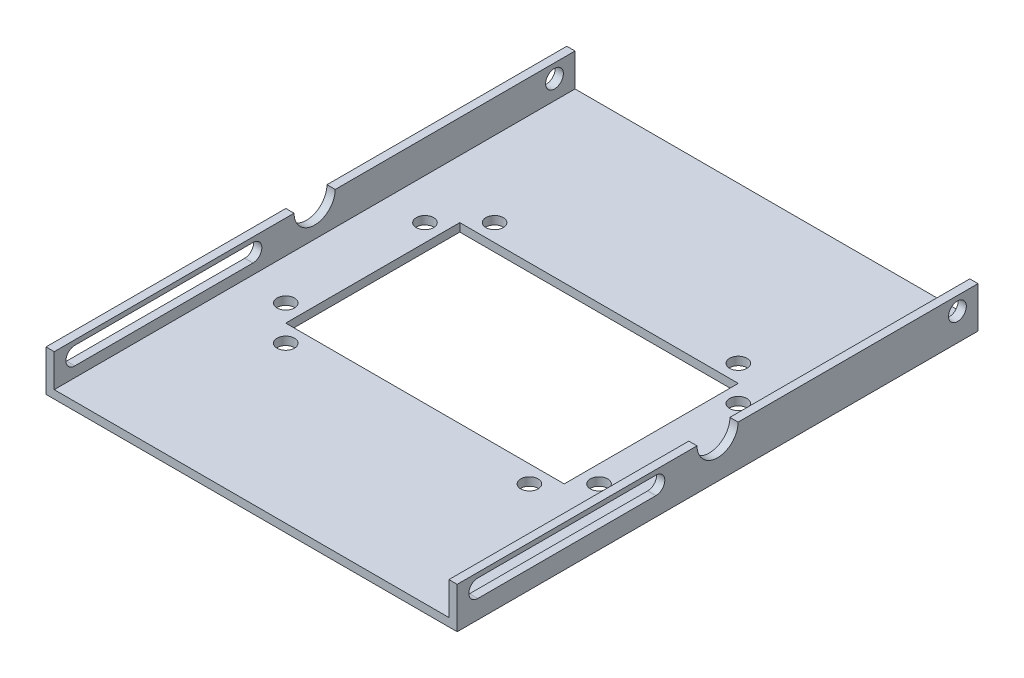
ISO-10303-21;
HEADER;
FILE_DESCRIPTION(('STEP AP214'),'2;1');
FILE_NAME('part.step','',(''),(''),'','','');
FILE_SCHEMA(('AUTOMOTIVE_DESIGN { 1 0 10303 214 1 1 1 1 }'));
ENDSEC;
DATA;
#1=APPLICATION_CONTEXT('core data for automotive mechanical design processes');
#2=APPLICATION_PROTOCOL_DEFINITION('international standard','automotive_design',2000,#1);
#3=PRODUCT_CONTEXT('',#1,'mechanical');
#4=PRODUCT('Part','Part','',(#3));
#5=PRODUCT_RELATED_PRODUCT_CATEGORY('part','',(#4));
#6=PRODUCT_DEFINITION_FORMATION('','',#4);
#7=PRODUCT_DEFINITION_CONTEXT('part definition',#1,'design');
#8=PRODUCT_DEFINITION('design','',#6,#7);
#9=PRODUCT_DEFINITION_SHAPE('','',#8);
#10=(LENGTH_UNIT() NAMED_UNIT(*) SI_UNIT(.MILLI.,.METRE.));
#11=(NAMED_UNIT(*) PLANE_ANGLE_UNIT() SI_UNIT($,.RADIAN.));
#12=(NAMED_UNIT(*) SI_UNIT($,.STERADIAN.) SOLID_ANGLE_UNIT());
#13=UNCERTAINTY_MEASURE_WITH_UNIT(LENGTH_MEASURE(1.E-05),#10,'distance_accuracy_value','');
#14=(GEOMETRIC_REPRESENTATION_CONTEXT(3) GLOBAL_UNCERTAINTY_ASSIGNED_CONTEXT((#13)) GLOBAL_UNIT_ASSIGNED_CONTEXT((#10,
#11,#12)) REPRESENTATION_CONTEXT('',''));
#15=CARTESIAN_POINT('',(0.,0.,0.));
#16=DIRECTION('',(0.,0.,1.));
#17=DIRECTION('',(1.,0.,0.));
#18=AXIS2_PLACEMENT_3D('',#15,#16,#17);
#19=CARTESIAN_POINT('',(-75.,15.,-95.));
#20=DIRECTION('',(0.,-1.,0.));
#21=DIRECTION('',(0.,0.,-1.));
#22=AXIS2_PLACEMENT_3D('',#19,#20,#21);
#23=PLANE('',#22);
#24=DIRECTION('',(0.,0.,1.));
#25=VECTOR('',#24,1.);
#26=CARTESIAN_POINT('',(-75.,15.,-95.));
#27=LINE('',#26,#25);
#28=CARTESIAN_POINT('',(-75.,15.,-95.));
#29=VERTEX_POINT('',#28);
#30=CARTESIAN_POINT('',(-75.,15.,-7.5));
#31=VERTEX_POINT('',#30);
#32=EDGE_CURVE('E390',#29,#31,#27,.T.);
#33=ORIENTED_EDGE('',*,*,#32,.T.);
#34=DIRECTION('',(1.,0.,0.));
#35=VECTOR('',#34,1.);
#36=CARTESIAN_POINT('',(-75.,15.,-7.5));
#37=LINE('',#36,#35);
#38=CARTESIAN_POINT('',(-72.,15.,-7.5));
#39=VERTEX_POINT('',#38);
#40=EDGE_CURVE('E278',#31,#39,#37,.T.);
#41=ORIENTED_EDGE('',*,*,#40,.T.);
#42=DIRECTION('',(0.,0.,1.));
#43=VECTOR('',#42,1.);
#44=CARTESIAN_POINT('',(-72.,15.,-95.));
#45=LINE('',#44,#43);
#46=CARTESIAN_POINT('',(-72.,15.,-95.));
#47=VERTEX_POINT('',#46);
#48=EDGE_CURVE('E394',#47,#39,#45,.T.);
#49=ORIENTED_EDGE('',*,*,#48,.F.);
#50=DIRECTION('',(1.,0.,0.));
#51=VECTOR('',#50,1.);
#52=CARTESIAN_POINT('',(-75.,15.,-95.));
#53=LINE('',#52,#51);
#54=EDGE_CURVE('E376',#29,#47,#53,.T.);
#55=ORIENTED_EDGE('',*,*,#54,.F.);
#56=EDGE_LOOP('',(#33,#41,#49,#55));
#57=FACE_BOUND('',#56,.T.);
#58=ADVANCED_FACE('F44',(#57),#23,.F.);
#59=CARTESIAN_POINT('',(72.,15.,-95.));
#60=DIRECTION('',(0.,-1.,0.));
#61=DIRECTION('',(0.,0.,-1.));
#62=AXIS2_PLACEMENT_3D('',#59,#60,#61);
#63=PLANE('',#62);
#64=DIRECTION('',(0.,0.,1.));
#65=VECTOR('',#64,1.);
#66=CARTESIAN_POINT('',(72.,15.,-95.));
#67=LINE('',#66,#65);
#68=CARTESIAN_POINT('',(72.,15.,-95.));
#69=VERTEX_POINT('',#68);
#70=CARTESIAN_POINT('',(72.,15.,-7.5));
#71=VERTEX_POINT('',#70);
#72=EDGE_CURVE('E402',#69,#71,#67,.T.);
#73=ORIENTED_EDGE('',*,*,#72,.T.);
#74=DIRECTION('',(1.,0.,0.));
#75=VECTOR('',#74,1.);
#76=CARTESIAN_POINT('',(-75.,15.,-7.5));
#77=LINE('',#76,#75);
#78=CARTESIAN_POINT('',(75.,15.,-7.5));
#79=VERTEX_POINT('',#78);
#80=EDGE_CURVE('E13',#71,#79,#77,.T.);
#81=ORIENTED_EDGE('',*,*,#80,.T.);
#82=DIRECTION('',(0.,0.,1.));
#83=VECTOR('',#82,1.);
#84=CARTESIAN_POINT('',(75.,15.,-95.));
#85=LINE('',#84,#83);
#86=CARTESIAN_POINT('',(75.,15.,-95.));
#87=VERTEX_POINT('',#86);
#88=EDGE_CURVE('E406',#87,#79,#85,.T.);
#89=ORIENTED_EDGE('',*,*,#88,.F.);
#90=DIRECTION('',(1.,0.,0.));
#91=VECTOR('',#90,1.);
#92=CARTESIAN_POINT('',(72.,15.,-95.));
#93=LINE('',#92,#91);
#94=EDGE_CURVE('E368',#69,#87,#93,.T.);
#95=ORIENTED_EDGE('',*,*,#94,.F.);
#96=EDGE_LOOP('',(#73,#81,#89,#95));
#97=FACE_BOUND('',#96,.T.);
#98=ADVANCED_FACE('F467',(#97),#63,.F.);
#99=CARTESIAN_POINT('',(75.,0.,-95.));
#100=DIRECTION('',(1.,0.,0.));
#101=DIRECTION('',(0.,0.,-1.));
#102=AXIS2_PLACEMENT_3D('',#99,#100,#101);
#103=PLANE('',#102);
#104=CARTESIAN_POINT('',(75.,15.,0.));
#105=DIRECTION('',(1.,0.,0.));
#106=DIRECTION('',(0.,0.,-1.));
#107=AXIS2_PLACEMENT_3D('',#104,#105,#106);
#108=CIRCLE('',#107,7.5);
#109=CARTESIAN_POINT('',(75.,15.,7.5));
#110=VERTEX_POINT('',#109);
#111=EDGE_CURVE('E270',#110,#79,#108,.T.);
#112=ORIENTED_EDGE('',*,*,#111,.F.);
#113=CARTESIAN_POINT('',(75.,15.,95.));
#114=VERTEX_POINT('',#113);
#115=EDGE_CURVE('E384',#110,#114,#85,.T.);
#116=ORIENTED_EDGE('',*,*,#115,.T.);
#117=DIRECTION('',(0.,1.,0.));
#118=VECTOR('',#117,1.);
#119=CARTESIAN_POINT('',(75.,0.,95.));
#120=LINE('',#119,#118);
#121=CARTESIAN_POINT('',(75.,0.,95.));
#122=VERTEX_POINT('',#121);
#123=EDGE_CURVE('E341',#122,#114,#120,.T.);
#124=ORIENTED_EDGE('',*,*,#123,.F.);
#125=DIRECTION('',(0.,0.,1.));
#126=VECTOR('',#125,1.);
#127=CARTESIAN_POINT('',(75.,0.,-95.));
#128=LINE('',#127,#126);
#129=CARTESIAN_POINT('',(75.,0.,-95.));
#130=VERTEX_POINT('',#129);
#131=EDGE_CURVE('E385',#130,#122,#128,.T.);
#132=ORIENTED_EDGE('',*,*,#131,.F.);
#133=DIRECTION('',(0.,1.,0.));
#134=VECTOR('',#133,1.);
#135=CARTESIAN_POINT('',(75.,0.,-95.));
#136=LINE('',#135,#134);
#137=EDGE_CURVE('E365',#130,#87,#136,.T.);
#138=ORIENTED_EDGE('',*,*,#137,.T.);
#139=ORIENTED_EDGE('',*,*,#88,.T.);
#140=EDGE_LOOP('',(#112,#116,#124,#132,#138,#139));
#141=FACE_BOUND('',#140,.T.);
#142=CARTESIAN_POINT('',(75.,10.,-87.5));
#143=DIRECTION('',(-1.,0.,0.));
#144=DIRECTION('',(0.,0.,1.));
#145=AXIS2_PLACEMENT_3D('',#142,#143,#144);
#146=CIRCLE('',#145,3.23850000000001);
#147=CARTESIAN_POINT('',(75.,10.,-84.2615));
#148=VERTEX_POINT('',#147);
#149=EDGE_CURVE('E282',#148,#148,#146,.T.);
#150=ORIENTED_EDGE('',*,*,#149,.T.);
#151=EDGE_LOOP('',(#150));
#152=FACE_BOUND('',#151,.T.);
#153=CARTESIAN_POINT('',(75.,10.,87.5));
#154=DIRECTION('',(-1.,0.,0.));
#155=DIRECTION('',(0.,0.,1.));
#156=AXIS2_PLACEMENT_3D('',#153,#154,#155);
#157=CIRCLE('',#156,3.2385);
#158=CARTESIAN_POINT('',(75.,6.76150000000002,87.5));
#159=VERTEX_POINT('',#158);
#160=CARTESIAN_POINT('',(75.,13.2385,87.5));
#161=VERTEX_POINT('',#160);
#162=EDGE_CURVE('E290',#159,#161,#157,.T.);
#163=ORIENTED_EDGE('',*,*,#162,.T.);
#164=DIRECTION('',(0.,0.,-1.));
#165=VECTOR('',#164,1.);
#166=CARTESIAN_POINT('',(75.,13.2385,87.5));
#167=LINE('',#166,#165);
#168=CARTESIAN_POINT('',(75.,13.2385,22.5));
#169=VERTEX_POINT('',#168);
#170=EDGE_CURVE('E293',#161,#169,#167,.T.);
#171=ORIENTED_EDGE('',*,*,#170,.T.);
#172=CARTESIAN_POINT('',(75.,10.,22.5));
#173=DIRECTION('',(-1.,0.,0.));
#174=DIRECTION('',(0.,0.,1.));
#175=AXIS2_PLACEMENT_3D('',#172,#173,#174);
#176=CIRCLE('',#175,3.2385);
#177=CARTESIAN_POINT('',(75.,6.76150000000001,22.5));
#178=VERTEX_POINT('',#177);
#179=EDGE_CURVE('E297',#169,#178,#176,.T.);
#180=ORIENTED_EDGE('',*,*,#179,.T.);
#181=DIRECTION('',(0.,0.,1.));
#182=VECTOR('',#181,1.);
#183=CARTESIAN_POINT('',(75.,6.76150000000002,87.5));
#184=LINE('',#183,#182);
#185=EDGE_CURVE('E300',#178,#159,#184,.T.);
#186=ORIENTED_EDGE('',*,*,#185,.T.);
#187=EDGE_LOOP('',(#163,#171,#180,#186));
#188=FACE_BOUND('',#187,.T.);
#189=ADVANCED_FACE('F46',(#141,#152,#188),#103,.T.);
#190=CARTESIAN_POINT('',(-75.,0.,-95.));
#191=DIRECTION('',(0.,-1.,0.));
#192=DIRECTION('',(0.,0.,-1.));
#193=AXIS2_PLACEMENT_3D('',#190,#191,#192);
#194=PLANE('',#193);
#195=CARTESIAN_POINT('',(-44.45,0.,-38.1));
#196=DIRECTION('',(0.,-1.,0.));
#197=DIRECTION('',(0.,0.,-1.));
#198=AXIS2_PLACEMENT_3D('',#195,#196,#197);
#199=CIRCLE('',#198,3.175);
#200=CARTESIAN_POINT('',(-44.45,0.,-41.275));
#201=VERTEX_POINT('',#200);
#202=EDGE_CURVE('E261',#201,#201,#199,.T.);
#203=ORIENTED_EDGE('',*,*,#202,.F.);
#204=EDGE_LOOP('',(#203));
#205=FACE_BOUND('',#204,.T.);
#206=CARTESIAN_POINT('',(44.45,0.,-38.1));
#207=DIRECTION('',(0.,-1.,0.));
#208=DIRECTION('',(0.,0.,-1.));
#209=AXIS2_PLACEMENT_3D('',#206,#207,#208);
#210=CIRCLE('',#209,3.175);
#211=CARTESIAN_POINT('',(44.45,0.,-41.275));
#212=VERTEX_POINT('',#211);
#213=EDGE_CURVE('E258',#212,#212,#210,.T.);
#214=ORIENTED_EDGE('',*,*,#213,.F.);
#215=EDGE_LOOP('',(#214));
#216=FACE_BOUND('',#215,.T.);
#217=CARTESIAN_POINT('',(-44.45,0.,38.1));
#218=DIRECTION('',(0.,-1.,0.));
#219=DIRECTION('',(0.,0.,-1.));
#220=AXIS2_PLACEMENT_3D('',#217,#218,#219);
#221=CIRCLE('',#220,3.175);
#222=CARTESIAN_POINT('',(-44.45,0.,34.925));
#223=VERTEX_POINT('',#222);
#224=EDGE_CURVE('E255',#223,#223,#221,.T.);
#225=ORIENTED_EDGE('',*,*,#224,.F.);
#226=EDGE_LOOP('',(#225));
#227=FACE_BOUND('',#226,.T.);
#228=CARTESIAN_POINT('',(44.45,0.,38.1));
#229=DIRECTION('',(0.,-1.,0.));
#230=DIRECTION('',(0.,0.,-1.));
#231=AXIS2_PLACEMENT_3D('',#228,#229,#230);
#232=CIRCLE('',#231,3.175);
#233=CARTESIAN_POINT('',(44.45,0.,34.925));
#234=VERTEX_POINT('',#233);
#235=EDGE_CURVE('E252',#234,#234,#232,.T.);
#236=ORIENTED_EDGE('',*,*,#235,.F.);
#237=EDGE_LOOP('',(#236));
#238=FACE_BOUND('',#237,.T.);
#239=CARTESIAN_POINT('',(-57.15,0.,-25.4));
#240=DIRECTION('',(0.,-1.,0.));
#241=DIRECTION('',(0.,0.,-1.));
#242=AXIS2_PLACEMENT_3D('',#239,#240,#241);
#243=CIRCLE('',#242,3.17499999999997);
#244=CARTESIAN_POINT('',(-57.15,0.,-28.575));
#245=VERTEX_POINT('',#244);
#246=EDGE_CURVE('E249',#245,#245,#243,.T.);
#247=ORIENTED_EDGE('',*,*,#246,.F.);
#248=EDGE_LOOP('',(#247));
#249=FACE_BOUND('',#248,.T.);
#250=CARTESIAN_POINT('',(57.15,0.,-25.4));
#251=DIRECTION('',(0.,-1.,0.));
#252=DIRECTION('',(0.,0.,-1.));
#253=AXIS2_PLACEMENT_3D('',#250,#251,#252);
#254=CIRCLE('',#253,3.175);
#255=CARTESIAN_POINT('',(57.15,0.,-28.575));
#256=VERTEX_POINT('',#255);
#257=EDGE_CURVE('E246',#256,#256,#254,.T.);
#258=ORIENTED_EDGE('',*,*,#257,.F.);
#259=EDGE_LOOP('',(#258));
#260=FACE_BOUND('',#259,.T.);
#261=CARTESIAN_POINT('',(-57.15,0.,25.4));
#262=DIRECTION('',(0.,-1.,0.));
#263=DIRECTION('',(0.,0.,-1.));
#264=AXIS2_PLACEMENT_3D('',#261,#262,#263);
#265=CIRCLE('',#264,3.17499999999997);
#266=CARTESIAN_POINT('',(-57.15,0.,22.225));
#267=VERTEX_POINT('',#266);
#268=EDGE_CURVE('E243',#267,#267,#265,.T.);
#269=ORIENTED_EDGE('',*,*,#268,.F.);
#270=EDGE_LOOP('',(#269));
#271=FACE_BOUND('',#270,.T.);
#272=CARTESIAN_POINT('',(57.15,0.,25.4));
#273=DIRECTION('',(0.,-1.,0.));
#274=DIRECTION('',(0.,0.,-1.));
#275=AXIS2_PLACEMENT_3D('',#272,#273,#274);
#276=CIRCLE('',#275,3.175);
#277=CARTESIAN_POINT('',(57.15,0.,22.225));
#278=VERTEX_POINT('',#277);
#279=EDGE_CURVE('E240',#278,#278,#276,.T.);
#280=ORIENTED_EDGE('',*,*,#279,.F.);
#281=EDGE_LOOP('',(#280));
#282=FACE_BOUND('',#281,.T.);
#283=DIRECTION('',(0.,0.,1.));
#284=VECTOR('',#283,1.);
#285=CARTESIAN_POINT('',(50.8,0.,-95.));
#286=LINE('',#285,#284);
#287=CARTESIAN_POINT('',(50.8,0.,-31.75));
#288=VERTEX_POINT('',#287);
#289=CARTESIAN_POINT('',(50.8,0.,31.75));
#290=VERTEX_POINT('',#289);
#291=EDGE_CURVE('E238',#288,#290,#286,.T.);
#292=ORIENTED_EDGE('',*,*,#291,.F.);
#293=DIRECTION('',(1.,0.,0.));
#294=VECTOR('',#293,1.);
#295=CARTESIAN_POINT('',(-75.,0.,-31.75));
#296=LINE('',#295,#294);
#297=CARTESIAN_POINT('',(-50.8,0.,-31.75));
#298=VERTEX_POINT('',#297);
#299=EDGE_CURVE('E231',#298,#288,#296,.T.);
#300=ORIENTED_EDGE('',*,*,#299,.F.);
#301=DIRECTION('',(0.,0.,-1.));
#302=VECTOR('',#301,1.);
#303=CARTESIAN_POINT('',(-50.8,0.,-95.));
#304=LINE('',#303,#302);
#305=CARTESIAN_POINT('',(-50.8,0.,31.75));
#306=VERTEX_POINT('',#305);
#307=EDGE_CURVE('E211',#306,#298,#304,.T.);
#308=ORIENTED_EDGE('',*,*,#307,.F.);
#309=DIRECTION('',(-1.,0.,0.));
#310=VECTOR('',#309,1.);
#311=CARTESIAN_POINT('',(-75.,0.,31.75));
#312=LINE('',#311,#310);
#313=EDGE_CURVE('E236',#290,#306,#312,.T.);
#314=ORIENTED_EDGE('',*,*,#313,.F.);
#315=EDGE_LOOP('',(#292,#300,#308,#314));
#316=FACE_BOUND('',#315,.T.);
#317=ORIENTED_EDGE('',*,*,#131,.T.);
#318=DIRECTION('',(1.,0.,0.));
#319=VECTOR('',#318,1.);
#320=CARTESIAN_POINT('',(-75.,0.,95.));
#321=LINE('',#320,#319);
#322=CARTESIAN_POINT('',(-75.,0.,95.));
#323=VERTEX_POINT('',#322);
#324=EDGE_CURVE('E362',#323,#122,#321,.T.);
#325=ORIENTED_EDGE('',*,*,#324,.F.);
#326=DIRECTION('',(0.,0.,1.));
#327=VECTOR('',#326,1.);
#328=CARTESIAN_POINT('',(-75.,0.,-95.));
#329=LINE('',#328,#327);
#330=CARTESIAN_POINT('',(-75.,0.,-95.));
#331=VERTEX_POINT('',#330);
#332=EDGE_CURVE('E388',#331,#323,#329,.T.);
#333=ORIENTED_EDGE('',*,*,#332,.F.);
#334=DIRECTION('',(1.,0.,0.));
#335=VECTOR('',#334,1.);
#336=CARTESIAN_POINT('',(-75.,0.,-95.));
#337=LINE('',#336,#335);
#338=EDGE_CURVE('E381',#331,#130,#337,.T.);
#339=ORIENTED_EDGE('',*,*,#338,.T.);
#340=EDGE_LOOP('',(#317,#325,#333,#339));
#341=FACE_BOUND('',#340,.T.);
#342=ADVANCED_FACE('F456',(#205,#216,#227,#238,#249,#260,#271,#282,#316,#341),#194,.T.);
#343=CARTESIAN_POINT('',(-75.,0.,-95.));
#344=DIRECTION('',(-1.,0.,0.));
#345=DIRECTION('',(0.,0.,1.));
#346=AXIS2_PLACEMENT_3D('',#343,#344,#345);
#347=PLANE('',#346);
#348=CARTESIAN_POINT('',(-75.,15.,0.));
#349=DIRECTION('',(1.,0.,0.));
#350=DIRECTION('',(0.,0.,-1.));
#351=AXIS2_PLACEMENT_3D('',#348,#349,#350);
#352=CIRCLE('',#351,7.5);
#353=CARTESIAN_POINT('',(-75.,15.,7.5));
#354=VERTEX_POINT('',#353);
#355=EDGE_CURVE('E264',#354,#31,#352,.T.);
#356=ORIENTED_EDGE('',*,*,#355,.T.);
#357=ORIENTED_EDGE('',*,*,#32,.F.);
#358=DIRECTION('',(0.,-1.,0.));
#359=VECTOR('',#358,1.);
#360=CARTESIAN_POINT('',(-75.,0.,-95.));
#361=LINE('',#360,#359);
#362=EDGE_CURVE('E378',#29,#331,#361,.T.);
#363=ORIENTED_EDGE('',*,*,#362,.T.);
#364=ORIENTED_EDGE('',*,*,#332,.T.);
#365=DIRECTION('',(0.,-1.,0.));
#366=VECTOR('',#365,1.);
#367=CARTESIAN_POINT('',(-75.,0.,95.));
#368=LINE('',#367,#366);
#369=CARTESIAN_POINT('',(-75.,15.,95.));
#370=VERTEX_POINT('',#369);
#371=EDGE_CURVE('E359',#370,#323,#368,.T.);
#372=ORIENTED_EDGE('',*,*,#371,.F.);
#373=EDGE_CURVE('E393',#354,#370,#27,.T.);
#374=ORIENTED_EDGE('',*,*,#373,.F.);
#375=EDGE_LOOP('',(#356,#357,#363,#364,#372,#374));
#376=FACE_BOUND('',#375,.T.);
#377=CARTESIAN_POINT('',(-75.,10.,-87.5));
#378=DIRECTION('',(-1.,0.,0.));
#379=DIRECTION('',(0.,0.,1.));
#380=AXIS2_PLACEMENT_3D('',#377,#378,#379);
#381=CIRCLE('',#380,3.23850000000001);
#382=CARTESIAN_POINT('',(-75.,10.,-84.2615));
#383=VERTEX_POINT('',#382);
#384=EDGE_CURVE('E286',#383,#383,#381,.T.);
#385=ORIENTED_EDGE('',*,*,#384,.F.);
#386=EDGE_LOOP('',(#385));
#387=FACE_BOUND('',#386,.T.);
#388=CARTESIAN_POINT('',(-75.,10.,87.5));
#389=DIRECTION('',(-1.,0.,0.));
#390=DIRECTION('',(0.,0.,1.));
#391=AXIS2_PLACEMENT_3D('',#388,#389,#390);
#392=CIRCLE('',#391,3.2385);
#393=CARTESIAN_POINT('',(-75.,6.76150000000002,87.5));
#394=VERTEX_POINT('',#393);
#395=CARTESIAN_POINT('',(-75.,13.2385,87.5));
#396=VERTEX_POINT('',#395);
#397=EDGE_CURVE('E281',#394,#396,#392,.T.);
#398=ORIENTED_EDGE('',*,*,#397,.F.);
#399=DIRECTION('',(0.,0.,1.));
#400=VECTOR('',#399,1.);
#401=CARTESIAN_POINT('',(-75.,6.76150000000002,87.5));
#402=LINE('',#401,#400);
#403=CARTESIAN_POINT('',(-75.,6.76150000000001,22.5));
#404=VERTEX_POINT('',#403);
#405=EDGE_CURVE('E294',#404,#394,#402,.T.);
#406=ORIENTED_EDGE('',*,*,#405,.F.);
#407=CARTESIAN_POINT('',(-75.,10.,22.5));
#408=DIRECTION('',(-1.,0.,0.));
#409=DIRECTION('',(0.,0.,1.));
#410=AXIS2_PLACEMENT_3D('',#407,#408,#409);
#411=CIRCLE('',#410,3.2385);
#412=CARTESIAN_POINT('',(-75.,13.2385,22.5));
#413=VERTEX_POINT('',#412);
#414=EDGE_CURVE('E308',#413,#404,#411,.T.);
#415=ORIENTED_EDGE('',*,*,#414,.F.);
#416=DIRECTION('',(0.,0.,-1.));
#417=VECTOR('',#416,1.);
#418=CARTESIAN_POINT('',(-75.,13.2385,87.5));
#419=LINE('',#418,#417);
#420=EDGE_CURVE('E305',#396,#413,#419,.T.);
#421=ORIENTED_EDGE('',*,*,#420,.F.);
#422=EDGE_LOOP('',(#398,#406,#415,#421));
#423=FACE_BOUND('',#422,.T.);
#424=ADVANCED_FACE('F451',(#376,#387,#423),#347,.T.);
#425=CARTESIAN_POINT('',(-72.,15.,7.5));
#426=VERTEX_POINT('',#425);
#427=CARTESIAN_POINT('',(-72.,15.,95.));
#428=VERTEX_POINT('',#427);
#429=EDGE_CURVE('E397',#426,#428,#45,.T.);
#430=ORIENTED_EDGE('',*,*,#429,.F.);
#431=DIRECTION('',(1.,0.,0.));
#432=VECTOR('',#431,1.);
#433=CARTESIAN_POINT('',(-75.,15.,7.5));
#434=LINE('',#433,#432);
#435=EDGE_CURVE('E275',#426,#354,#434,.F.);
#436=ORIENTED_EDGE('',*,*,#435,.T.);
#437=ORIENTED_EDGE('',*,*,#373,.T.);
#438=DIRECTION('',(1.,0.,0.));
#439=VECTOR('',#438,1.);
#440=CARTESIAN_POINT('',(-75.,15.,95.));
#441=LINE('',#440,#439);
#442=EDGE_CURVE('E356',#370,#428,#441,.T.);
#443=ORIENTED_EDGE('',*,*,#442,.T.);
#444=EDGE_LOOP('',(#430,#436,#437,#443));
#445=FACE_BOUND('',#444,.T.);
#446=ADVANCED_FACE('F447',(#445),#23,.F.);
#447=CARTESIAN_POINT('',(-72.,0.,-95.));
#448=DIRECTION('',(-1.,0.,0.));
#449=DIRECTION('',(0.,0.,1.));
#450=AXIS2_PLACEMENT_3D('',#447,#448,#449);
#451=PLANE('',#450);
#452=CARTESIAN_POINT('',(-72.,10.,-87.5));
#453=DIRECTION('',(-1.,0.,0.));
#454=DIRECTION('',(0.,0.,1.));
#455=AXIS2_PLACEMENT_3D('',#452,#453,#454);
#456=CIRCLE('',#455,3.23850000000001);
#457=CARTESIAN_POINT('',(-72.,10.,-84.2615));
#458=VERTEX_POINT('',#457);
#459=EDGE_CURVE('E338',#458,#458,#456,.T.);
#460=ORIENTED_EDGE('',*,*,#459,.T.);
#461=EDGE_LOOP('',(#460));
#462=FACE_BOUND('',#461,.T.);
#463=DIRECTION('',(0.,0.,1.));
#464=VECTOR('',#463,1.);
#465=CARTESIAN_POINT('',(-72.,6.7615,-95.));
#466=LINE('',#465,#464);
#467=CARTESIAN_POINT('',(-72.,6.76150000000001,22.5));
#468=VERTEX_POINT('',#467);
#469=CARTESIAN_POINT('',(-72.,6.76150000000002,87.5));
#470=VERTEX_POINT('',#469);
#471=EDGE_CURVE('E331',#468,#470,#466,.T.);
#472=ORIENTED_EDGE('',*,*,#471,.T.);
#473=CARTESIAN_POINT('',(-72.,10.,87.5));
#474=DIRECTION('',(-1.,0.,0.));
#475=DIRECTION('',(0.,0.,1.));
#476=AXIS2_PLACEMENT_3D('',#473,#474,#475);
#477=CIRCLE('',#476,3.2385);
#478=CARTESIAN_POINT('',(-72.,13.2385,87.5));
#479=VERTEX_POINT('',#478);
#480=EDGE_CURVE('E334',#470,#479,#477,.T.);
#481=ORIENTED_EDGE('',*,*,#480,.T.);
#482=DIRECTION('',(0.,0.,-1.));
#483=VECTOR('',#482,1.);
#484=CARTESIAN_POINT('',(-72.,13.2385,-95.));
#485=LINE('',#484,#483);
#486=CARTESIAN_POINT('',(-72.,13.2385,22.5));
#487=VERTEX_POINT('',#486);
#488=EDGE_CURVE('E285',#479,#487,#485,.T.);
#489=ORIENTED_EDGE('',*,*,#488,.T.);
#490=CARTESIAN_POINT('',(-72.,10.,22.5));
#491=DIRECTION('',(-1.,0.,0.));
#492=DIRECTION('',(0.,0.,1.));
#493=AXIS2_PLACEMENT_3D('',#490,#491,#492);
#494=CIRCLE('',#493,3.2385);
#495=EDGE_CURVE('E328',#487,#468,#494,.T.);
#496=ORIENTED_EDGE('',*,*,#495,.T.);
#497=EDGE_LOOP('',(#472,#481,#489,#496));
#498=FACE_BOUND('',#497,.T.);
#499=ORIENTED_EDGE('',*,*,#48,.T.);
#500=CARTESIAN_POINT('',(-72.,15.,0.));
#501=DIRECTION('',(-1.,0.,0.));
#502=DIRECTION('',(0.,0.,1.));
#503=AXIS2_PLACEMENT_3D('',#500,#501,#502);
#504=CIRCLE('',#503,7.5);
#505=EDGE_CURVE('E272',#39,#426,#504,.T.);
#506=ORIENTED_EDGE('',*,*,#505,.T.);
#507=ORIENTED_EDGE('',*,*,#429,.T.);
#508=DIRECTION('',(0.,1.,0.));
#509=VECTOR('',#508,1.);
#510=CARTESIAN_POINT('',(-72.,0.,95.));
#511=LINE('',#510,#509);
#512=CARTESIAN_POINT('',(-72.,3.,95.));
#513=VERTEX_POINT('',#512);
#514=EDGE_CURVE('E353',#428,#513,#511,.F.);
#515=ORIENTED_EDGE('',*,*,#514,.T.);
#516=DIRECTION('',(0.,0.,1.));
#517=VECTOR('',#516,1.);
#518=CARTESIAN_POINT('',(-72.,3.,-95.));
#519=LINE('',#518,#517);
#520=CARTESIAN_POINT('',(-72.,3.,-95.));
#521=VERTEX_POINT('',#520);
#522=EDGE_CURVE('E398',#521,#513,#519,.T.);
#523=ORIENTED_EDGE('',*,*,#522,.F.);
#524=DIRECTION('',(0.,1.,0.));
#525=VECTOR('',#524,1.);
#526=CARTESIAN_POINT('',(-72.,0.,-95.));
#527=LINE('',#526,#525);
#528=EDGE_CURVE('E374',#47,#521,#527,.F.);
#529=ORIENTED_EDGE('',*,*,#528,.F.);
#530=EDGE_LOOP('',(#499,#506,#507,#515,#523,#529));
#531=FACE_BOUND('',#530,.T.);
#532=ADVANCED_FACE('F443',(#462,#498,#531),#451,.F.);
#533=CARTESIAN_POINT('',(-75.,3.,-95.));
#534=DIRECTION('',(0.,-1.,0.));
#535=DIRECTION('',(0.,0.,-1.));
#536=AXIS2_PLACEMENT_3D('',#533,#534,#535);
#537=PLANE('',#536);
#538=CARTESIAN_POINT('',(-44.45,3.,-38.1));
#539=DIRECTION('',(0.,1.,0.));
#540=DIRECTION('',(0.,0.,1.));
#541=AXIS2_PLACEMENT_3D('',#538,#539,#540);
#542=CIRCLE('',#541,3.175);
#543=CARTESIAN_POINT('',(-44.45,3.,-34.925));
#544=VERTEX_POINT('',#543);
#545=EDGE_CURVE('E698',#544,#544,#542,.T.);
#546=ORIENTED_EDGE('',*,*,#545,.F.);
#547=EDGE_LOOP('',(#546));
#548=FACE_BOUND('',#547,.T.);
#549=CARTESIAN_POINT('',(44.45,3.,-38.1));
#550=DIRECTION('',(0.,1.,0.));
#551=DIRECTION('',(0.,0.,1.));
#552=AXIS2_PLACEMENT_3D('',#549,#550,#551);
#553=CIRCLE('',#552,3.175);
#554=CARTESIAN_POINT('',(44.45,3.,-34.925));
#555=VERTEX_POINT('',#554);
#556=EDGE_CURVE('E699',#555,#555,#553,.T.);
#557=ORIENTED_EDGE('',*,*,#556,.F.);
#558=EDGE_LOOP('',(#557));
#559=FACE_BOUND('',#558,.T.);
#560=CARTESIAN_POINT('',(-44.45,3.,38.1));
#561=DIRECTION('',(0.,1.,0.));
#562=DIRECTION('',(0.,0.,1.));
#563=AXIS2_PLACEMENT_3D('',#560,#561,#562);
#564=CIRCLE('',#563,3.175);
#565=CARTESIAN_POINT('',(-44.45,3.,41.275));
#566=VERTEX_POINT('',#565);
#567=EDGE_CURVE('E702',#566,#566,#564,.T.);
#568=ORIENTED_EDGE('',*,*,#567,.F.);
#569=EDGE_LOOP('',(#568));
#570=FACE_BOUND('',#569,.T.);
#571=CARTESIAN_POINT('',(44.45,3.,38.1));
#572=DIRECTION('',(0.,1.,0.));
#573=DIRECTION('',(0.,0.,1.));
#574=AXIS2_PLACEMENT_3D('',#571,#572,#573);
#575=CIRCLE('',#574,3.175);
#576=CARTESIAN_POINT('',(44.45,3.,41.275));
#577=VERTEX_POINT('',#576);
#578=EDGE_CURVE('E710',#577,#577,#575,.T.);
#579=ORIENTED_EDGE('',*,*,#578,.F.);
#580=EDGE_LOOP('',(#579));
#581=FACE_BOUND('',#580,.T.);
#582=CARTESIAN_POINT('',(-57.15,3.,-25.4));
#583=DIRECTION('',(0.,1.,0.));
#584=DIRECTION('',(0.,0.,1.));
#585=AXIS2_PLACEMENT_3D('',#582,#583,#584);
#586=CIRCLE('',#585,3.17499999999997);
#587=CARTESIAN_POINT('',(-57.15,3.,-22.225));
#588=VERTEX_POINT('',#587);
#589=EDGE_CURVE('E712',#588,#588,#586,.T.);
#590=ORIENTED_EDGE('',*,*,#589,.F.);
#591=EDGE_LOOP('',(#590));
#592=FACE_BOUND('',#591,.T.);
#593=CARTESIAN_POINT('',(57.15,3.,-25.4));
#594=DIRECTION('',(0.,1.,0.));
#595=DIRECTION('',(0.,0.,1.));
#596=AXIS2_PLACEMENT_3D('',#593,#594,#595);
#597=CIRCLE('',#596,3.175);
#598=CARTESIAN_POINT('',(57.15,3.,-22.225));
#599=VERTEX_POINT('',#598);
#600=EDGE_CURVE('E716',#599,#599,#597,.T.);
#601=ORIENTED_EDGE('',*,*,#600,.F.);
#602=EDGE_LOOP('',(#601));
#603=FACE_BOUND('',#602,.T.);
#604=CARTESIAN_POINT('',(-57.15,3.,25.4));
#605=DIRECTION('',(0.,1.,0.));
#606=DIRECTION('',(0.,0.,1.));
#607=AXIS2_PLACEMENT_3D('',#604,#605,#606);
#608=CIRCLE('',#607,3.17499999999997);
#609=CARTESIAN_POINT('',(-57.15,3.,28.575));
#610=VERTEX_POINT('',#609);
#611=EDGE_CURVE('E721',#610,#610,#608,.T.);
#612=ORIENTED_EDGE('',*,*,#611,.F.);
#613=EDGE_LOOP('',(#612));
#614=FACE_BOUND('',#613,.T.);
#615=CARTESIAN_POINT('',(57.15,3.,25.4));
#616=DIRECTION('',(0.,1.,0.));
#617=DIRECTION('',(0.,0.,1.));
#618=AXIS2_PLACEMENT_3D('',#615,#616,#617);
#619=CIRCLE('',#618,3.175);
#620=CARTESIAN_POINT('',(57.15,3.,28.575));
#621=VERTEX_POINT('',#620);
#622=EDGE_CURVE('E705',#621,#621,#619,.T.);
#623=ORIENTED_EDGE('',*,*,#622,.F.);
#624=EDGE_LOOP('',(#623));
#625=FACE_BOUND('',#624,.T.);
#626=DIRECTION('',(-1.,0.,0.));
#627=VECTOR('',#626,1.);
#628=CARTESIAN_POINT('',(-50.8,3.,-31.75));
#629=LINE('',#628,#627);
#630=CARTESIAN_POINT('',(50.8,3.,-31.75));
#631=VERTEX_POINT('',#630);
#632=CARTESIAN_POINT('',(-50.8,3.,-31.75));
#633=VERTEX_POINT('',#632);
#634=EDGE_CURVE('E217',#631,#633,#629,.T.);
#635=ORIENTED_EDGE('',*,*,#634,.F.);
#636=DIRECTION('',(0.,0.,-1.));
#637=VECTOR('',#636,1.);
#638=CARTESIAN_POINT('',(50.8,3.,-31.75));
#639=LINE('',#638,#637);
#640=CARTESIAN_POINT('',(50.8,3.,31.75));
#641=VERTEX_POINT('',#640);
#642=EDGE_CURVE('E67',#641,#631,#639,.T.);
#643=ORIENTED_EDGE('',*,*,#642,.F.);
#644=DIRECTION('',(1.,0.,0.));
#645=VECTOR('',#644,1.);
#646=CARTESIAN_POINT('',(-50.8,3.,31.75));
#647=LINE('',#646,#645);
#648=CARTESIAN_POINT('',(-50.8,3.,31.75));
#649=VERTEX_POINT('',#648);
#650=EDGE_CURVE('E224',#649,#641,#647,.T.);
#651=ORIENTED_EDGE('',*,*,#650,.F.);
#652=DIRECTION('',(0.,0.,1.));
#653=VECTOR('',#652,1.);
#654=CARTESIAN_POINT('',(-50.8,3.,-31.75));
#655=LINE('',#654,#653);
#656=EDGE_CURVE('E208',#633,#649,#655,.T.);
#657=ORIENTED_EDGE('',*,*,#656,.F.);
#658=EDGE_LOOP('',(#635,#643,#651,#657));
#659=FACE_BOUND('',#658,.T.);
#660=ORIENTED_EDGE('',*,*,#522,.T.);
#661=DIRECTION('',(1.,0.,0.));
#662=VECTOR('',#661,1.);
#663=CARTESIAN_POINT('',(-75.,3.,95.));
#664=LINE('',#663,#662);
#665=CARTESIAN_POINT('',(72.,3.,95.));
#666=VERTEX_POINT('',#665);
#667=EDGE_CURVE('E350',#513,#666,#664,.T.);
#668=ORIENTED_EDGE('',*,*,#667,.T.);
#669=DIRECTION('',(0.,0.,1.));
#670=VECTOR('',#669,1.);
#671=CARTESIAN_POINT('',(72.,3.,-95.));
#672=LINE('',#671,#670);
#673=CARTESIAN_POINT('',(72.,3.,-95.));
#674=VERTEX_POINT('',#673);
#675=EDGE_CURVE('E400',#674,#666,#672,.T.);
#676=ORIENTED_EDGE('',*,*,#675,.F.);
#677=DIRECTION('',(1.,0.,0.));
#678=VECTOR('',#677,1.);
#679=CARTESIAN_POINT('',(-75.,3.,-95.));
#680=LINE('',#679,#678);
#681=EDGE_CURVE('E372',#521,#674,#680,.T.);
#682=ORIENTED_EDGE('',*,*,#681,.F.);
#683=EDGE_LOOP('',(#660,#668,#676,#682));
#684=FACE_BOUND('',#683,.T.);
#685=ADVANCED_FACE('F221',(#548,#559,#570,#581,#592,#603,#614,#625,#659,#684),#537,.F.);
#686=CARTESIAN_POINT('',(72.,0.,-95.));
#687=DIRECTION('',(1.,0.,0.));
#688=DIRECTION('',(0.,0.,-1.));
#689=AXIS2_PLACEMENT_3D('',#686,#687,#688);
#690=PLANE('',#689);
#691=CARTESIAN_POINT('',(72.,10.,-87.5));
#692=DIRECTION('',(1.,0.,0.));
#693=DIRECTION('',(0.,0.,-1.));
#694=AXIS2_PLACEMENT_3D('',#691,#692,#693);
#695=CIRCLE('',#694,3.23850000000001);
#696=CARTESIAN_POINT('',(72.,10.,-90.7385));
#697=VERTEX_POINT('',#696);
#698=EDGE_CURVE('E337',#697,#697,#695,.T.);
#699=ORIENTED_EDGE('',*,*,#698,.T.);
#700=EDGE_LOOP('',(#699));
#701=FACE_BOUND('',#700,.T.);
#702=DIRECTION('',(0.,0.,1.));
#703=VECTOR('',#702,1.);
#704=CARTESIAN_POINT('',(72.,13.2385,-95.));
#705=LINE('',#704,#703);
#706=CARTESIAN_POINT('',(72.,13.2385,22.5));
#707=VERTEX_POINT('',#706);
#708=CARTESIAN_POINT('',(72.,13.2385,87.5));
#709=VERTEX_POINT('',#708);
#710=EDGE_CURVE('E387',#707,#709,#705,.T.);
#711=ORIENTED_EDGE('',*,*,#710,.T.);
#712=CARTESIAN_POINT('',(72.,10.,87.5));
#713=DIRECTION('',(1.,0.,0.));
#714=DIRECTION('',(0.,0.,-1.));
#715=AXIS2_PLACEMENT_3D('',#712,#713,#714);
#716=CIRCLE('',#715,3.2385);
#717=CARTESIAN_POINT('',(72.,6.76150000000002,87.5));
#718=VERTEX_POINT('',#717);
#719=EDGE_CURVE('E417',#709,#718,#716,.T.);
#720=ORIENTED_EDGE('',*,*,#719,.T.);
#721=DIRECTION('',(0.,0.,-1.));
#722=VECTOR('',#721,1.);
#723=CARTESIAN_POINT('',(72.,6.7615,-95.));
#724=LINE('',#723,#722);
#725=CARTESIAN_POINT('',(72.,6.76150000000001,22.5));
#726=VERTEX_POINT('',#725);
#727=EDGE_CURVE('E414',#718,#726,#724,.T.);
#728=ORIENTED_EDGE('',*,*,#727,.T.);
#729=CARTESIAN_POINT('',(72.,10.,22.5));
#730=DIRECTION('',(1.,0.,0.));
#731=DIRECTION('',(0.,0.,-1.));
#732=AXIS2_PLACEMENT_3D('',#729,#730,#731);
#733=CIRCLE('',#732,3.2385);
#734=EDGE_CURVE('E411',#726,#707,#733,.T.);
#735=ORIENTED_EDGE('',*,*,#734,.T.);
#736=EDGE_LOOP('',(#711,#720,#728,#735));
#737=FACE_BOUND('',#736,.T.);
#738=CARTESIAN_POINT('',(72.,15.,7.50000000000001));
#739=VERTEX_POINT('',#738);
#740=CARTESIAN_POINT('',(72.,15.,95.));
#741=VERTEX_POINT('',#740);
#742=EDGE_CURVE('E405',#739,#741,#67,.T.);
#743=ORIENTED_EDGE('',*,*,#742,.F.);
#744=CARTESIAN_POINT('',(72.,15.,0.));
#745=DIRECTION('',(1.,0.,0.));
#746=DIRECTION('',(0.,0.,-1.));
#747=AXIS2_PLACEMENT_3D('',#744,#745,#746);
#748=CIRCLE('',#747,7.5);
#749=EDGE_CURVE('E267',#739,#71,#748,.T.);
#750=ORIENTED_EDGE('',*,*,#749,.T.);
#751=ORIENTED_EDGE('',*,*,#72,.F.);
#752=DIRECTION('',(0.,1.,0.));
#753=VECTOR('',#752,1.);
#754=CARTESIAN_POINT('',(72.,0.,-95.));
#755=LINE('',#754,#753);
#756=EDGE_CURVE('E370',#674,#69,#755,.T.);
#757=ORIENTED_EDGE('',*,*,#756,.F.);
#758=ORIENTED_EDGE('',*,*,#675,.T.);
#759=DIRECTION('',(0.,1.,0.));
#760=VECTOR('',#759,1.);
#761=CARTESIAN_POINT('',(72.,0.,95.));
#762=LINE('',#761,#760);
#763=EDGE_CURVE('E347',#666,#741,#762,.T.);
#764=ORIENTED_EDGE('',*,*,#763,.T.);
#765=EDGE_LOOP('',(#743,#750,#751,#757,#758,#764));
#766=FACE_BOUND('',#765,.T.);
#767=ADVANCED_FACE('F430',(#701,#737,#766),#690,.F.);
#768=ORIENTED_EDGE('',*,*,#115,.F.);
#769=DIRECTION('',(1.,0.,0.));
#770=VECTOR('',#769,1.);
#771=CARTESIAN_POINT('',(-75.,15.,7.5));
#772=LINE('',#771,#770);
#773=EDGE_CURVE('E52',#110,#739,#772,.F.);
#774=ORIENTED_EDGE('',*,*,#773,.T.);
#775=ORIENTED_EDGE('',*,*,#742,.T.);
#776=DIRECTION('',(1.,0.,0.));
#777=VECTOR('',#776,1.);
#778=CARTESIAN_POINT('',(72.,15.,95.));
#779=LINE('',#778,#777);
#780=EDGE_CURVE('E344',#741,#114,#779,.T.);
#781=ORIENTED_EDGE('',*,*,#780,.T.);
#782=EDGE_LOOP('',(#768,#774,#775,#781));
#783=FACE_BOUND('',#782,.T.);
#784=ADVANCED_FACE('F425',(#783),#63,.F.);
#785=CARTESIAN_POINT('',(0.,0.,-95.));
#786=DIRECTION('',(0.,0.,-1.));
#787=DIRECTION('',(-1.,0.,0.));
#788=AXIS2_PLACEMENT_3D('',#785,#786,#787);
#789=PLANE('',#788);
#790=ORIENTED_EDGE('',*,*,#137,.F.);
#791=ORIENTED_EDGE('',*,*,#338,.F.);
#792=ORIENTED_EDGE('',*,*,#362,.F.);
#793=ORIENTED_EDGE('',*,*,#54,.T.);
#794=ORIENTED_EDGE('',*,*,#528,.T.);
#795=ORIENTED_EDGE('',*,*,#681,.T.);
#796=ORIENTED_EDGE('',*,*,#756,.T.);
#797=ORIENTED_EDGE('',*,*,#94,.T.);
#798=EDGE_LOOP('',(#790,#791,#792,#793,#794,#795,#796,#797));
#799=FACE_BOUND('',#798,.T.);
#800=ADVANCED_FACE('F462',(#799),#789,.T.);
#801=CARTESIAN_POINT('',(0.,0.,95.));
#802=DIRECTION('',(0.,0.,-1.));
#803=DIRECTION('',(-1.,0.,0.));
#804=AXIS2_PLACEMENT_3D('',#801,#802,#803);
#805=PLANE('',#804);
#806=ORIENTED_EDGE('',*,*,#123,.T.);
#807=ORIENTED_EDGE('',*,*,#780,.F.);
#808=ORIENTED_EDGE('',*,*,#763,.F.);
#809=ORIENTED_EDGE('',*,*,#667,.F.);
#810=ORIENTED_EDGE('',*,*,#514,.F.);
#811=ORIENTED_EDGE('',*,*,#442,.F.);
#812=ORIENTED_EDGE('',*,*,#371,.T.);
#813=ORIENTED_EDGE('',*,*,#324,.T.);
#814=EDGE_LOOP('',(#806,#807,#808,#809,#810,#811,#812,#813));
#815=FACE_BOUND('',#814,.T.);
#816=ADVANCED_FACE('F437',(#815),#805,.F.);
#817=CARTESIAN_POINT('',(75.,13.2385,87.5));
#818=DIRECTION('',(0.,1.,0.));
#819=DIRECTION('',(0.,0.,1.));
#820=AXIS2_PLACEMENT_3D('',#817,#818,#819);
#821=PLANE('',#820);
#822=DIRECTION('',(-1.,0.,0.));
#823=VECTOR('',#822,1.);
#824=CARTESIAN_POINT('',(75.,13.2385,22.5));
#825=LINE('',#824,#823);
#826=EDGE_CURVE('E320',#169,#707,#825,.T.);
#827=ORIENTED_EDGE('',*,*,#826,.F.);
#828=ORIENTED_EDGE('',*,*,#170,.F.);
#829=DIRECTION('',(-1.,0.,0.));
#830=VECTOR('',#829,1.);
#831=CARTESIAN_POINT('',(75.,13.2385,87.5));
#832=LINE('',#831,#830);
#833=EDGE_CURVE('E324',#161,#709,#832,.T.);
#834=ORIENTED_EDGE('',*,*,#833,.T.);
#835=ORIENTED_EDGE('',*,*,#710,.F.);
#836=EDGE_LOOP('',(#827,#828,#834,#835));
#837=FACE_BOUND('',#836,.T.);
#838=ADVANCED_FACE('F509',(#837),#821,.F.);
#839=CARTESIAN_POINT('',(75.,10.,22.5));
#840=DIRECTION('',(-1.,0.,0.));
#841=DIRECTION('',(0.,0.,1.));
#842=AXIS2_PLACEMENT_3D('',#839,#840,#841);
#843=CYLINDRICAL_SURFACE('',#842,3.2385);
#844=DIRECTION('',(-1.,0.,0.));
#845=VECTOR('',#844,1.);
#846=CARTESIAN_POINT('',(75.,6.76150000000001,22.5));
#847=LINE('',#846,#845);
#848=EDGE_CURVE('E316',#178,#726,#847,.T.);
#849=ORIENTED_EDGE('',*,*,#848,.F.);
#850=ORIENTED_EDGE('',*,*,#179,.F.);
#851=ORIENTED_EDGE('',*,*,#826,.T.);
#852=ORIENTED_EDGE('',*,*,#734,.F.);
#853=EDGE_LOOP('',(#849,#850,#851,#852));
#854=FACE_BOUND('',#853,.T.);
#855=ADVANCED_FACE('F523',(#854),#843,.F.);
#856=CARTESIAN_POINT('',(75.,6.76150000000002,87.5));
#857=DIRECTION('',(0.,-1.,0.));
#858=DIRECTION('',(0.,0.,-1.));
#859=AXIS2_PLACEMENT_3D('',#856,#857,#858);
#860=PLANE('',#859);
#861=DIRECTION('',(-1.,0.,0.));
#862=VECTOR('',#861,1.);
#863=CARTESIAN_POINT('',(75.,6.76150000000002,87.5));
#864=LINE('',#863,#862);
#865=EDGE_CURVE('E289',#159,#718,#864,.T.);
#866=ORIENTED_EDGE('',*,*,#865,.F.);
#867=ORIENTED_EDGE('',*,*,#185,.F.);
#868=ORIENTED_EDGE('',*,*,#848,.T.);
#869=ORIENTED_EDGE('',*,*,#727,.F.);
#870=EDGE_LOOP('',(#866,#867,#868,#869));
#871=FACE_BOUND('',#870,.T.);
#872=ADVANCED_FACE('F526',(#871),#860,.F.);
#873=CARTESIAN_POINT('',(75.,10.,87.5));
#874=DIRECTION('',(-1.,0.,0.));
#875=DIRECTION('',(0.,0.,1.));
#876=AXIS2_PLACEMENT_3D('',#873,#874,#875);
#877=CYLINDRICAL_SURFACE('',#876,3.2385);
#878=ORIENTED_EDGE('',*,*,#833,.F.);
#879=ORIENTED_EDGE('',*,*,#162,.F.);
#880=ORIENTED_EDGE('',*,*,#865,.T.);
#881=ORIENTED_EDGE('',*,*,#719,.F.);
#882=EDGE_LOOP('',(#878,#879,#880,#881));
#883=FACE_BOUND('',#882,.T.);
#884=ADVANCED_FACE('F515',(#883),#877,.F.);
#885=CARTESIAN_POINT('',(75.,10.,-87.5));
#886=DIRECTION('',(-1.,0.,0.));
#887=DIRECTION('',(0.,0.,1.));
#888=AXIS2_PLACEMENT_3D('',#885,#886,#887);
#889=CYLINDRICAL_SURFACE('',#888,3.23850000000001);
#890=ORIENTED_EDGE('',*,*,#149,.F.);
#891=EDGE_LOOP('',(#890));
#892=FACE_BOUND('',#891,.T.);
#893=ORIENTED_EDGE('',*,*,#698,.F.);
#894=EDGE_LOOP('',(#893));
#895=FACE_BOUND('',#894,.T.);
#896=ADVANCED_FACE('F482',(#892,#895),#889,.F.);
#897=EDGE_CURVE('E315',#470,#394,#864,.T.);
#898=ORIENTED_EDGE('',*,*,#897,.T.);
#899=ORIENTED_EDGE('',*,*,#397,.T.);
#900=EDGE_CURVE('E303',#479,#396,#832,.T.);
#901=ORIENTED_EDGE('',*,*,#900,.F.);
#902=ORIENTED_EDGE('',*,*,#480,.F.);
#903=EDGE_LOOP('',(#898,#899,#901,#902));
#904=FACE_BOUND('',#903,.T.);
#905=ADVANCED_FACE('F510',(#904),#877,.F.);
#906=EDGE_CURVE('E319',#468,#404,#847,.T.);
#907=ORIENTED_EDGE('',*,*,#906,.T.);
#908=ORIENTED_EDGE('',*,*,#405,.T.);
#909=ORIENTED_EDGE('',*,*,#897,.F.);
#910=ORIENTED_EDGE('',*,*,#471,.F.);
#911=EDGE_LOOP('',(#907,#908,#909,#910));
#912=FACE_BOUND('',#911,.T.);
#913=ADVANCED_FACE('F513',(#912),#860,.F.);
#914=EDGE_CURVE('E323',#487,#413,#825,.T.);
#915=ORIENTED_EDGE('',*,*,#914,.T.);
#916=ORIENTED_EDGE('',*,*,#414,.T.);
#917=ORIENTED_EDGE('',*,*,#906,.F.);
#918=ORIENTED_EDGE('',*,*,#495,.F.);
#919=EDGE_LOOP('',(#915,#916,#917,#918));
#920=FACE_BOUND('',#919,.T.);
#921=ADVANCED_FACE('F518',(#920),#843,.F.);
#922=ORIENTED_EDGE('',*,*,#900,.T.);
#923=ORIENTED_EDGE('',*,*,#420,.T.);
#924=ORIENTED_EDGE('',*,*,#914,.F.);
#925=ORIENTED_EDGE('',*,*,#488,.F.);
#926=EDGE_LOOP('',(#922,#923,#924,#925));
#927=FACE_BOUND('',#926,.T.);
#928=ADVANCED_FACE('F479',(#927),#821,.F.);
#929=ORIENTED_EDGE('',*,*,#384,.T.);
#930=EDGE_LOOP('',(#929));
#931=FACE_BOUND('',#930,.T.);
#932=ORIENTED_EDGE('',*,*,#459,.F.);
#933=EDGE_LOOP('',(#932));
#934=FACE_BOUND('',#933,.T.);
#935=ADVANCED_FACE('F471',(#931,#934),#889,.F.);
#936=CARTESIAN_POINT('',(-75.,15.,0.));
#937=DIRECTION('',(1.,0.,0.));
#938=DIRECTION('',(0.,0.,-1.));
#939=AXIS2_PLACEMENT_3D('',#936,#937,#938);
#940=CYLINDRICAL_SURFACE('',#939,7.5);
#941=ORIENTED_EDGE('',*,*,#749,.F.);
#942=ORIENTED_EDGE('',*,*,#773,.F.);
#943=ORIENTED_EDGE('',*,*,#111,.T.);
#944=ORIENTED_EDGE('',*,*,#80,.F.);
#945=EDGE_LOOP('',(#941,#942,#943,#944));
#946=FACE_BOUND('',#945,.T.);
#947=ADVANCED_FACE('F468',(#946),#940,.F.);
#948=ORIENTED_EDGE('',*,*,#355,.F.);
#949=ORIENTED_EDGE('',*,*,#435,.F.);
#950=ORIENTED_EDGE('',*,*,#505,.F.);
#951=ORIENTED_EDGE('',*,*,#40,.F.);
#952=EDGE_LOOP('',(#948,#949,#950,#951));
#953=FACE_BOUND('',#952,.T.);
#954=ADVANCED_FACE('F470',(#953),#940,.F.);
#955=CARTESIAN_POINT('',(50.8,-7.,-31.75));
#956=DIRECTION('',(1.,0.,0.));
#957=DIRECTION('',(0.,0.,-1.));
#958=AXIS2_PLACEMENT_3D('',#955,#956,#957);
#959=PLANE('',#958);
#960=ORIENTED_EDGE('',*,*,#291,.T.);
#961=DIRECTION('',(0.,1.,0.));
#962=VECTOR('',#961,1.);
#963=CARTESIAN_POINT('',(50.8,-7.,31.75));
#964=LINE('',#963,#962);
#965=EDGE_CURVE('E229',#290,#641,#964,.T.);
#966=ORIENTED_EDGE('',*,*,#965,.T.);
#967=ORIENTED_EDGE('',*,*,#642,.T.);
#968=DIRECTION('',(0.,1.,0.));
#969=VECTOR('',#968,1.);
#970=CARTESIAN_POINT('',(50.8,-7.,-31.75));
#971=LINE('',#970,#969);
#972=EDGE_CURVE('E214',#288,#631,#971,.T.);
#973=ORIENTED_EDGE('',*,*,#972,.F.);
#974=EDGE_LOOP('',(#960,#966,#967,#973));
#975=FACE_BOUND('',#974,.T.);
#976=ADVANCED_FACE('F477',(#975),#959,.F.);
#977=CARTESIAN_POINT('',(-50.8,-7.,31.75));
#978=DIRECTION('',(0.,0.,1.));
#979=DIRECTION('',(1.,0.,0.));
#980=AXIS2_PLACEMENT_3D('',#977,#978,#979);
#981=PLANE('',#980);
#982=ORIENTED_EDGE('',*,*,#313,.T.);
#983=DIRECTION('',(0.,1.,0.));
#984=VECTOR('',#983,1.);
#985=CARTESIAN_POINT('',(-50.8,-7.,31.75));
#986=LINE('',#985,#984);
#987=EDGE_CURVE('E213',#306,#649,#986,.T.);
#988=ORIENTED_EDGE('',*,*,#987,.T.);
#989=ORIENTED_EDGE('',*,*,#650,.T.);
#990=ORIENTED_EDGE('',*,*,#965,.F.);
#991=EDGE_LOOP('',(#982,#988,#989,#990));
#992=FACE_BOUND('',#991,.T.);
#993=ADVANCED_FACE('F586',(#992),#981,.F.);
#994=CARTESIAN_POINT('',(-50.8,-7.,-31.75));
#995=DIRECTION('',(-1.,0.,0.));
#996=DIRECTION('',(0.,0.,1.));
#997=AXIS2_PLACEMENT_3D('',#994,#995,#996);
#998=PLANE('',#997);
#999=ORIENTED_EDGE('',*,*,#307,.T.);
#1000=DIRECTION('',(0.,1.,0.));
#1001=VECTOR('',#1000,1.);
#1002=CARTESIAN_POINT('',(-50.8,-7.,-31.75));
#1003=LINE('',#1002,#1001);
#1004=EDGE_CURVE('E59',#298,#633,#1003,.T.);
#1005=ORIENTED_EDGE('',*,*,#1004,.T.);
#1006=ORIENTED_EDGE('',*,*,#656,.T.);
#1007=ORIENTED_EDGE('',*,*,#987,.F.);
#1008=EDGE_LOOP('',(#999,#1005,#1006,#1007));
#1009=FACE_BOUND('',#1008,.T.);
#1010=ADVANCED_FACE('F205',(#1009),#998,.F.);
#1011=CARTESIAN_POINT('',(-50.8,-7.,-31.75));
#1012=DIRECTION('',(0.,0.,-1.));
#1013=DIRECTION('',(-1.,0.,0.));
#1014=AXIS2_PLACEMENT_3D('',#1011,#1012,#1013);
#1015=PLANE('',#1014);
#1016=ORIENTED_EDGE('',*,*,#299,.T.);
#1017=ORIENTED_EDGE('',*,*,#972,.T.);
#1018=ORIENTED_EDGE('',*,*,#634,.T.);
#1019=ORIENTED_EDGE('',*,*,#1004,.F.);
#1020=EDGE_LOOP('',(#1016,#1017,#1018,#1019));
#1021=FACE_BOUND('',#1020,.T.);
#1022=ADVANCED_FACE('F218',(#1021),#1015,.F.);
#1023=CARTESIAN_POINT('',(57.15,-7.,25.4));
#1024=DIRECTION('',(0.,1.,0.));
#1025=DIRECTION('',(0.,0.,1.));
#1026=AXIS2_PLACEMENT_3D('',#1023,#1024,#1025);
#1027=CYLINDRICAL_SURFACE('',#1026,3.175);
#1028=ORIENTED_EDGE('',*,*,#279,.T.);
#1029=EDGE_LOOP('',(#1028));
#1030=FACE_BOUND('',#1029,.T.);
#1031=ORIENTED_EDGE('',*,*,#622,.T.);
#1032=EDGE_LOOP('',(#1031));
#1033=FACE_BOUND('',#1032,.T.);
#1034=ADVANCED_FACE('F611',(#1030,#1033),#1027,.F.);
#1035=CARTESIAN_POINT('',(-57.15,-7.,25.4));
#1036=DIRECTION('',(0.,1.,0.));
#1037=DIRECTION('',(0.,0.,1.));
#1038=AXIS2_PLACEMENT_3D('',#1035,#1036,#1037);
#1039=CYLINDRICAL_SURFACE('',#1038,3.17499999999997);
#1040=ORIENTED_EDGE('',*,*,#268,.T.);
#1041=EDGE_LOOP('',(#1040));
#1042=FACE_BOUND('',#1041,.T.);
#1043=ORIENTED_EDGE('',*,*,#611,.T.);
#1044=EDGE_LOOP('',(#1043));
#1045=FACE_BOUND('',#1044,.T.);
#1046=ADVANCED_FACE('F620',(#1042,#1045),#1039,.F.);
#1047=CARTESIAN_POINT('',(57.15,-7.,-25.4));
#1048=DIRECTION('',(0.,1.,0.));
#1049=DIRECTION('',(0.,0.,1.));
#1050=AXIS2_PLACEMENT_3D('',#1047,#1048,#1049);
#1051=CYLINDRICAL_SURFACE('',#1050,3.175);
#1052=ORIENTED_EDGE('',*,*,#257,.T.);
#1053=EDGE_LOOP('',(#1052));
#1054=FACE_BOUND('',#1053,.T.);
#1055=ORIENTED_EDGE('',*,*,#600,.T.);
#1056=EDGE_LOOP('',(#1055));
#1057=FACE_BOUND('',#1056,.T.);
#1058=ADVANCED_FACE('F630',(#1054,#1057),#1051,.F.);
#1059=CARTESIAN_POINT('',(-57.15,-7.,-25.4));
#1060=DIRECTION('',(0.,1.,0.));
#1061=DIRECTION('',(0.,0.,1.));
#1062=AXIS2_PLACEMENT_3D('',#1059,#1060,#1061);
#1063=CYLINDRICAL_SURFACE('',#1062,3.17499999999997);
#1064=ORIENTED_EDGE('',*,*,#246,.T.);
#1065=EDGE_LOOP('',(#1064));
#1066=FACE_BOUND('',#1065,.T.);
#1067=ORIENTED_EDGE('',*,*,#589,.T.);
#1068=EDGE_LOOP('',(#1067));
#1069=FACE_BOUND('',#1068,.T.);
#1070=ADVANCED_FACE('F640',(#1066,#1069),#1063,.F.);
#1071=CARTESIAN_POINT('',(44.45,-7.,38.1));
#1072=DIRECTION('',(0.,1.,0.));
#1073=DIRECTION('',(0.,0.,1.));
#1074=AXIS2_PLACEMENT_3D('',#1071,#1072,#1073);
#1075=CYLINDRICAL_SURFACE('',#1074,3.175);
#1076=ORIENTED_EDGE('',*,*,#235,.T.);
#1077=EDGE_LOOP('',(#1076));
#1078=FACE_BOUND('',#1077,.T.);
#1079=ORIENTED_EDGE('',*,*,#578,.T.);
#1080=EDGE_LOOP('',(#1079));
#1081=FACE_BOUND('',#1080,.T.);
#1082=ADVANCED_FACE('F650',(#1078,#1081),#1075,.F.);
#1083=CARTESIAN_POINT('',(-44.45,-7.,38.1));
#1084=DIRECTION('',(0.,1.,0.));
#1085=DIRECTION('',(0.,0.,1.));
#1086=AXIS2_PLACEMENT_3D('',#1083,#1084,#1085);
#1087=CYLINDRICAL_SURFACE('',#1086,3.175);
#1088=ORIENTED_EDGE('',*,*,#224,.T.);
#1089=EDGE_LOOP('',(#1088));
#1090=FACE_BOUND('',#1089,.T.);
#1091=ORIENTED_EDGE('',*,*,#567,.T.);
#1092=EDGE_LOOP('',(#1091));
#1093=FACE_BOUND('',#1092,.T.);
#1094=ADVANCED_FACE('F660',(#1090,#1093),#1087,.F.);
#1095=CARTESIAN_POINT('',(44.45,-7.,-38.1));
#1096=DIRECTION('',(0.,1.,0.));
#1097=DIRECTION('',(0.,0.,1.));
#1098=AXIS2_PLACEMENT_3D('',#1095,#1096,#1097);
#1099=CYLINDRICAL_SURFACE('',#1098,3.175);
#1100=ORIENTED_EDGE('',*,*,#213,.T.);
#1101=EDGE_LOOP('',(#1100));
#1102=FACE_BOUND('',#1101,.T.);
#1103=ORIENTED_EDGE('',*,*,#556,.T.);
#1104=EDGE_LOOP('',(#1103));
#1105=FACE_BOUND('',#1104,.T.);
#1106=ADVANCED_FACE('F670',(#1102,#1105),#1099,.F.);
#1107=CARTESIAN_POINT('',(-44.45,-7.,-38.1));
#1108=DIRECTION('',(0.,1.,0.));
#1109=DIRECTION('',(0.,0.,1.));
#1110=AXIS2_PLACEMENT_3D('',#1107,#1108,#1109);
#1111=CYLINDRICAL_SURFACE('',#1110,3.175);
#1112=ORIENTED_EDGE('',*,*,#202,.T.);
#1113=EDGE_LOOP('',(#1112));
#1114=FACE_BOUND('',#1113,.T.);
#1115=ORIENTED_EDGE('',*,*,#545,.T.);
#1116=EDGE_LOOP('',(#1115));
#1117=FACE_BOUND('',#1116,.T.);
#1118=ADVANCED_FACE('F680',(#1114,#1117),#1111,.F.);
#1119=CLOSED_SHELL('',(#58,#98,#189,#342,#424,#446,#532,#685,#767,#784,#800,#816,#838,#855,#872,
#884,#896,#905,#913,#921,#928,#935,#947,#954,#976,#993,#1010,#1022,#1034,#1046,#1058,#1070,
#1082,#1094,#1106,#1118));
#1120=MANIFOLD_SOLID_BREP('B2',#1119);
#1121=ADVANCED_BREP_SHAPE_REPRESENTATION('',(#18,#1120),#14);
#1122=SHAPE_DEFINITION_REPRESENTATION(#9,#1121);
ENDSEC;
END-ISO-10303-21;
